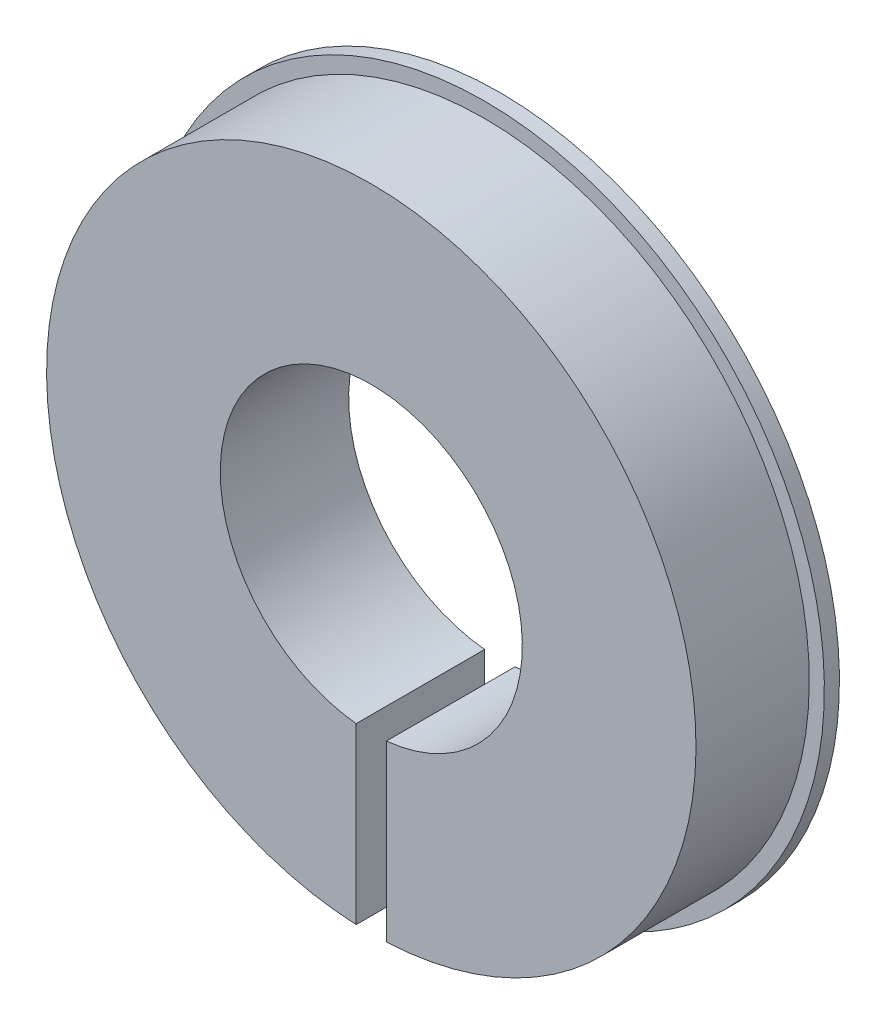
ISO-10303-21;
HEADER;
FILE_DESCRIPTION(('STEP AP214'),'2;1');
FILE_NAME('part.step','',(''),(''),'','','');
FILE_SCHEMA(('AUTOMOTIVE_DESIGN { 1 0 10303 214 1 1 1 1 }'));
ENDSEC;
DATA;
#1=APPLICATION_CONTEXT('core data for automotive mechanical design processes');
#2=APPLICATION_PROTOCOL_DEFINITION('international standard','automotive_design',2000,#1);
#3=PRODUCT_CONTEXT('',#1,'mechanical');
#4=PRODUCT('Part','Part','',(#3));
#5=PRODUCT_RELATED_PRODUCT_CATEGORY('part','',(#4));
#6=PRODUCT_DEFINITION_FORMATION('','',#4);
#7=PRODUCT_DEFINITION_CONTEXT('part definition',#1,'design');
#8=PRODUCT_DEFINITION('design','',#6,#7);
#9=PRODUCT_DEFINITION_SHAPE('','',#8);
#10=(LENGTH_UNIT() NAMED_UNIT(*) SI_UNIT(.MILLI.,.METRE.));
#11=(NAMED_UNIT(*) PLANE_ANGLE_UNIT() SI_UNIT($,.RADIAN.));
#12=(NAMED_UNIT(*) SI_UNIT($,.STERADIAN.) SOLID_ANGLE_UNIT());
#13=UNCERTAINTY_MEASURE_WITH_UNIT(LENGTH_MEASURE(1.E-05),#10,'distance_accuracy_value','');
#14=(GEOMETRIC_REPRESENTATION_CONTEXT(3) GLOBAL_UNCERTAINTY_ASSIGNED_CONTEXT((#13)) GLOBAL_UNIT_ASSIGNED_CONTEXT((#10,
#11,#12)) REPRESENTATION_CONTEXT('',''));
#15=CARTESIAN_POINT('',(0.,0.,0.));
#16=DIRECTION('',(0.,0.,1.));
#17=DIRECTION('',(1.,0.,0.));
#18=AXIS2_PLACEMENT_3D('',#15,#16,#17);
#19=CARTESIAN_POINT('',(0.,0.,1.));
#20=DIRECTION('',(0.,0.,1.));
#21=DIRECTION('',(1.,0.,0.));
#22=AXIS2_PLACEMENT_3D('',#19,#20,#21);
#23=PLANE('',#22);
#24=DIRECTION('',(0.,-1.,0.));
#25=VECTOR('',#24,1.);
#26=CARTESIAN_POINT('',(-1.,0.,1.));
#27=LINE('',#26,#25);
#28=CARTESIAN_POINT('',(-1.,-21.4767315949145,1.));
#29=VERTEX_POINT('',#28);
#30=CARTESIAN_POINT('',(-1.,-22.477766792989,1.));
#31=VERTEX_POINT('',#30);
#32=EDGE_CURVE('E119',#29,#31,#27,.T.);
#33=ORIENTED_EDGE('',*,*,#32,.F.);
#34=CARTESIAN_POINT('',(0.,0.,1.));
#35=DIRECTION('',(0.,0.,1.));
#36=DIRECTION('',(1.,0.,0.));
#37=AXIS2_PLACEMENT_3D('',#34,#35,#36);
#38=CIRCLE('',#37,21.5);
#39=CARTESIAN_POINT('',(1.,-21.4767315949145,1.));
#40=VERTEX_POINT('',#39);
#41=EDGE_CURVE('E124',#40,#29,#38,.T.);
#42=ORIENTED_EDGE('',*,*,#41,.F.);
#43=DIRECTION('',(0.,1.,0.));
#44=VECTOR('',#43,1.);
#45=CARTESIAN_POINT('',(1.,0.,1.));
#46=LINE('',#45,#44);
#47=CARTESIAN_POINT('',(1.,-22.477766792989,1.));
#48=VERTEX_POINT('',#47);
#49=EDGE_CURVE('E108',#48,#40,#46,.T.);
#50=ORIENTED_EDGE('',*,*,#49,.F.);
#51=CARTESIAN_POINT('',(0.,0.,1.));
#52=DIRECTION('',(0.,0.,1.));
#53=DIRECTION('',(1.,0.,0.));
#54=AXIS2_PLACEMENT_3D('',#51,#52,#53);
#55=CIRCLE('',#54,22.5);
#56=EDGE_CURVE('E41',#48,#31,#55,.T.);
#57=ORIENTED_EDGE('',*,*,#56,.T.);
#58=EDGE_LOOP('',(#33,#42,#50,#57));
#59=FACE_BOUND('',#58,.T.);
#60=ADVANCED_FACE('F33',(#59),#23,.T.);
#61=CARTESIAN_POINT('',(0.,0.,1.));
#62=DIRECTION('',(0.,0.,-1.));
#63=DIRECTION('',(-1.,0.,0.));
#64=AXIS2_PLACEMENT_3D('',#61,#62,#63);
#65=CYLINDRICAL_SURFACE('',#64,22.5);
#66=CARTESIAN_POINT('',(0.,0.,0.));
#67=DIRECTION('',(0.,0.,1.));
#68=DIRECTION('',(1.,0.,0.));
#69=AXIS2_PLACEMENT_3D('',#66,#67,#68);
#70=CIRCLE('',#69,22.5);
#71=CARTESIAN_POINT('',(1.,-22.477766792989,0.));
#72=VERTEX_POINT('',#71);
#73=CARTESIAN_POINT('',(-1.,-22.477766792989,0.));
#74=VERTEX_POINT('',#73);
#75=EDGE_CURVE('E127',#72,#74,#70,.T.);
#76=ORIENTED_EDGE('',*,*,#75,.T.);
#77=DIRECTION('',(0.,0.,-1.));
#78=VECTOR('',#77,1.);
#79=CARTESIAN_POINT('',(-1.,-22.477766792989,1.));
#80=LINE('',#79,#78);
#81=EDGE_CURVE('E55',#74,#31,#80,.F.);
#82=ORIENTED_EDGE('',*,*,#81,.T.);
#83=ORIENTED_EDGE('',*,*,#56,.F.);
#84=DIRECTION('',(0.,0.,-1.));
#85=VECTOR('',#84,1.);
#86=CARTESIAN_POINT('',(1.,-22.477766792989,1.));
#87=LINE('',#86,#85);
#88=EDGE_CURVE('E110',#48,#72,#87,.T.);
#89=ORIENTED_EDGE('',*,*,#88,.T.);
#90=EDGE_LOOP('',(#76,#82,#83,#89));
#91=FACE_BOUND('',#90,.T.);
#92=ADVANCED_FACE('F35',(#91),#65,.T.);
#93=CARTESIAN_POINT('',(0.,0.,0.));
#94=DIRECTION('',(0.,0.,1.));
#95=DIRECTION('',(1.,0.,0.));
#96=AXIS2_PLACEMENT_3D('',#93,#94,#95);
#97=PLANE('',#96);
#98=CARTESIAN_POINT('',(0.,0.,0.));
#99=DIRECTION('',(0.,0.,1.));
#100=DIRECTION('',(1.,0.,0.));
#101=AXIS2_PLACEMENT_3D('',#98,#99,#100);
#102=CIRCLE('',#101,10.);
#103=CARTESIAN_POINT('',(0.999999999999998,-9.9498743710662,0.));
#104=VERTEX_POINT('',#103);
#105=CARTESIAN_POINT('',(-1.,-9.9498743710662,0.));
#106=VERTEX_POINT('',#105);
#107=EDGE_CURVE('E93',#104,#106,#102,.T.);
#108=ORIENTED_EDGE('',*,*,#107,.T.);
#109=DIRECTION('',(0.,-1.,0.));
#110=VECTOR('',#109,1.);
#111=CARTESIAN_POINT('',(-1.,0.,0.));
#112=LINE('',#111,#110);
#113=EDGE_CURVE('E122',#106,#74,#112,.T.);
#114=ORIENTED_EDGE('',*,*,#113,.T.);
#115=ORIENTED_EDGE('',*,*,#75,.F.);
#116=DIRECTION('',(0.,1.,0.));
#117=VECTOR('',#116,1.);
#118=CARTESIAN_POINT('',(1.,0.,0.));
#119=LINE('',#118,#117);
#120=EDGE_CURVE('E113',#72,#104,#119,.T.);
#121=ORIENTED_EDGE('',*,*,#120,.T.);
#122=EDGE_LOOP('',(#108,#114,#115,#121));
#123=FACE_BOUND('',#122,.T.);
#124=ADVANCED_FACE('F136',(#123),#97,.F.);
#125=CARTESIAN_POINT('',(0.,0.,8.5));
#126=DIRECTION('',(0.,0.,-1.));
#127=DIRECTION('',(-1.,0.,0.));
#128=AXIS2_PLACEMENT_3D('',#125,#126,#127);
#129=CYLINDRICAL_SURFACE('',#128,21.5);
#130=ORIENTED_EDGE('',*,*,#41,.T.);
#131=DIRECTION('',(0.,0.,-1.));
#132=VECTOR('',#131,1.);
#133=CARTESIAN_POINT('',(-1.,-21.4767315949145,8.5));
#134=LINE('',#133,#132);
#135=CARTESIAN_POINT('',(-1.,-21.4767315949145,8.5));
#136=VERTEX_POINT('',#135);
#137=EDGE_CURVE('E116',#29,#136,#134,.F.);
#138=ORIENTED_EDGE('',*,*,#137,.T.);
#139=CARTESIAN_POINT('',(0.,0.,8.5));
#140=DIRECTION('',(0.,0.,1.));
#141=DIRECTION('',(1.,0.,0.));
#142=AXIS2_PLACEMENT_3D('',#139,#140,#141);
#143=CIRCLE('',#142,21.5);
#144=CARTESIAN_POINT('',(1.,-21.4767315949145,8.5));
#145=VERTEX_POINT('',#144);
#146=EDGE_CURVE('E125',#145,#136,#143,.T.);
#147=ORIENTED_EDGE('',*,*,#146,.F.);
#148=DIRECTION('',(0.,0.,-1.));
#149=VECTOR('',#148,1.);
#150=CARTESIAN_POINT('',(1.,-21.4767315949145,8.5));
#151=LINE('',#150,#149);
#152=EDGE_CURVE('E47',#145,#40,#151,.T.);
#153=ORIENTED_EDGE('',*,*,#152,.T.);
#154=EDGE_LOOP('',(#130,#138,#147,#153));
#155=FACE_BOUND('',#154,.T.);
#156=ADVANCED_FACE('F140',(#155),#129,.T.);
#157=CARTESIAN_POINT('',(0.,0.,8.5));
#158=DIRECTION('',(0.,0.,1.));
#159=DIRECTION('',(1.,0.,0.));
#160=AXIS2_PLACEMENT_3D('',#157,#158,#159);
#161=PLANE('',#160);
#162=DIRECTION('',(0.,-1.,0.));
#163=VECTOR('',#162,1.);
#164=CARTESIAN_POINT('',(-1.,-9.9498743710662,8.5));
#165=LINE('',#164,#163);
#166=CARTESIAN_POINT('',(-1.,-9.9498743710662,8.5));
#167=VERTEX_POINT('',#166);
#168=EDGE_CURVE('E96',#167,#136,#165,.T.);
#169=ORIENTED_EDGE('',*,*,#168,.F.);
#170=CARTESIAN_POINT('',(0.,0.,8.5));
#171=DIRECTION('',(0.,0.,1.));
#172=DIRECTION('',(1.,0.,0.));
#173=AXIS2_PLACEMENT_3D('',#170,#171,#172);
#174=CIRCLE('',#173,10.);
#175=CARTESIAN_POINT('',(0.999999999999998,-9.9498743710662,8.5));
#176=VERTEX_POINT('',#175);
#177=EDGE_CURVE('E90',#176,#167,#174,.T.);
#178=ORIENTED_EDGE('',*,*,#177,.F.);
#179=DIRECTION('',(0.,1.,0.));
#180=VECTOR('',#179,1.);
#181=CARTESIAN_POINT('',(1.,0.,8.5));
#182=LINE('',#181,#180);
#183=EDGE_CURVE('E11',#145,#176,#182,.T.);
#184=ORIENTED_EDGE('',*,*,#183,.F.);
#185=ORIENTED_EDGE('',*,*,#146,.T.);
#186=EDGE_LOOP('',(#169,#178,#184,#185));
#187=FACE_BOUND('',#186,.T.);
#188=ADVANCED_FACE('F102',(#187),#161,.T.);
#189=CARTESIAN_POINT('',(-1.,-9.9498743710662,-1.5));
#190=DIRECTION('',(-1.,0.,0.));
#191=DIRECTION('',(0.,0.,1.));
#192=AXIS2_PLACEMENT_3D('',#189,#190,#191);
#193=PLANE('',#192);
#194=DIRECTION('',(0.,0.,1.));
#195=VECTOR('',#194,1.);
#196=CARTESIAN_POINT('',(-1.,-9.9498743710662,-1.5));
#197=LINE('',#196,#195);
#198=EDGE_CURVE('E95',#106,#167,#197,.T.);
#199=ORIENTED_EDGE('',*,*,#198,.T.);
#200=ORIENTED_EDGE('',*,*,#168,.T.);
#201=ORIENTED_EDGE('',*,*,#137,.F.);
#202=ORIENTED_EDGE('',*,*,#32,.T.);
#203=ORIENTED_EDGE('',*,*,#81,.F.);
#204=ORIENTED_EDGE('',*,*,#113,.F.);
#205=EDGE_LOOP('',(#199,#200,#201,#202,#203,#204));
#206=FACE_BOUND('',#205,.T.);
#207=ADVANCED_FACE('F137',(#206),#193,.F.);
#208=CARTESIAN_POINT('',(0.,0.,-1.5));
#209=DIRECTION('',(0.,0.,1.));
#210=DIRECTION('',(1.,0.,0.));
#211=AXIS2_PLACEMENT_3D('',#208,#209,#210);
#212=CYLINDRICAL_SURFACE('',#211,10.);
#213=DIRECTION('',(0.,0.,1.));
#214=VECTOR('',#213,1.);
#215=CARTESIAN_POINT('',(0.999999999999998,-9.9498743710662,-1.5));
#216=LINE('',#215,#214);
#217=EDGE_CURVE('E86',#104,#176,#216,.T.);
#218=ORIENTED_EDGE('',*,*,#217,.T.);
#219=ORIENTED_EDGE('',*,*,#177,.T.);
#220=ORIENTED_EDGE('',*,*,#198,.F.);
#221=ORIENTED_EDGE('',*,*,#107,.F.);
#222=EDGE_LOOP('',(#218,#219,#220,#221));
#223=FACE_BOUND('',#222,.T.);
#224=ADVANCED_FACE('F87',(#223),#212,.F.);
#225=CARTESIAN_POINT('',(1.,-9.9498743710662,-1.5));
#226=DIRECTION('',(1.,0.,0.));
#227=DIRECTION('',(0.,0.,-1.));
#228=AXIS2_PLACEMENT_3D('',#225,#226,#227);
#229=PLANE('',#228);
#230=ORIENTED_EDGE('',*,*,#88,.F.);
#231=ORIENTED_EDGE('',*,*,#49,.T.);
#232=ORIENTED_EDGE('',*,*,#152,.F.);
#233=ORIENTED_EDGE('',*,*,#183,.T.);
#234=ORIENTED_EDGE('',*,*,#217,.F.);
#235=ORIENTED_EDGE('',*,*,#120,.F.);
#236=EDGE_LOOP('',(#230,#231,#232,#233,#234,#235));
#237=FACE_BOUND('',#236,.T.);
#238=ADVANCED_FACE('F98',(#237),#229,.F.);
#239=CLOSED_SHELL('',(#60,#92,#124,#156,#188,#207,#224,#238));
#240=MANIFOLD_SOLID_BREP('B2',#239);
#241=ADVANCED_BREP_SHAPE_REPRESENTATION('',(#18,#240),#14);
#242=SHAPE_DEFINITION_REPRESENTATION(#9,#241);
ENDSEC;
END-ISO-10303-21;
